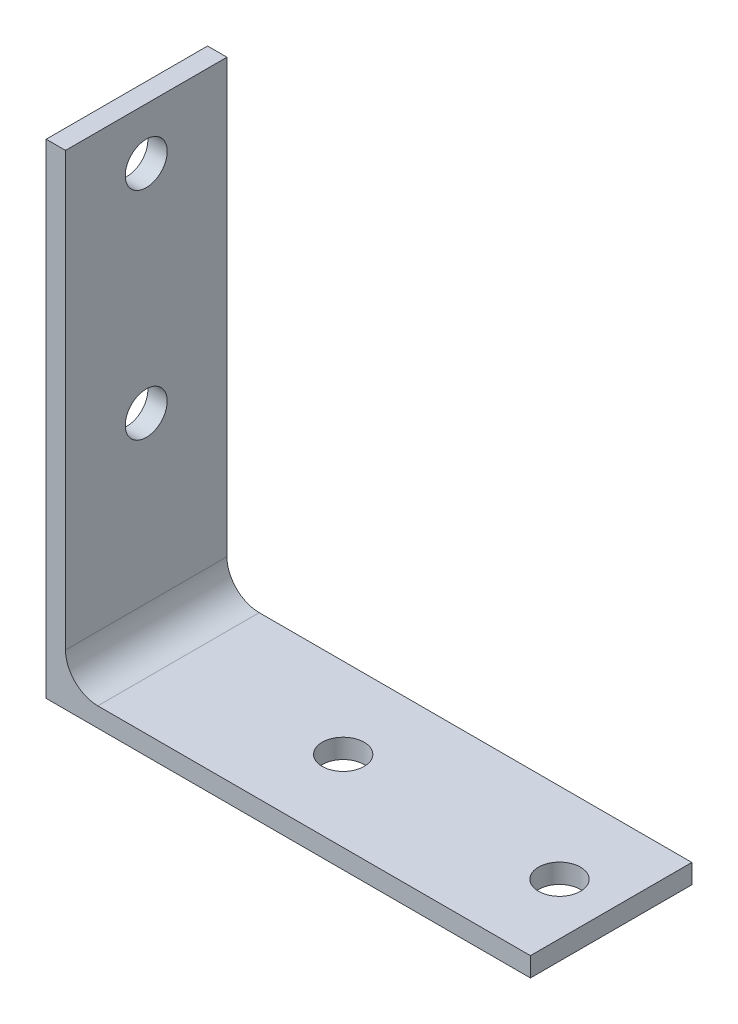
ISO-10303-21;
HEADER;
FILE_DESCRIPTION(('STEP AP214'),'2;1');
FILE_NAME('part.step','',(''),(''),'','','');
FILE_SCHEMA(('AUTOMOTIVE_DESIGN { 1 0 10303 214 1 1 1 1 }'));
ENDSEC;
DATA;
#1=APPLICATION_CONTEXT('core data for automotive mechanical design processes');
#2=APPLICATION_PROTOCOL_DEFINITION('international standard','automotive_design',2000,#1);
#3=PRODUCT_CONTEXT('',#1,'mechanical');
#4=PRODUCT('Part','Part','',(#3));
#5=PRODUCT_RELATED_PRODUCT_CATEGORY('part','',(#4));
#6=PRODUCT_DEFINITION_FORMATION('','',#4);
#7=PRODUCT_DEFINITION_CONTEXT('part definition',#1,'design');
#8=PRODUCT_DEFINITION('design','',#6,#7);
#9=PRODUCT_DEFINITION_SHAPE('','',#8);
#10=(LENGTH_UNIT() NAMED_UNIT(*) SI_UNIT(.MILLI.,.METRE.));
#11=(NAMED_UNIT(*) PLANE_ANGLE_UNIT() SI_UNIT($,.RADIAN.));
#12=(NAMED_UNIT(*) SI_UNIT($,.STERADIAN.) SOLID_ANGLE_UNIT());
#13=UNCERTAINTY_MEASURE_WITH_UNIT(LENGTH_MEASURE(1.E-05),#10,'distance_accuracy_value','');
#14=(GEOMETRIC_REPRESENTATION_CONTEXT(3) GLOBAL_UNCERTAINTY_ASSIGNED_CONTEXT((#13)) GLOBAL_UNIT_ASSIGNED_CONTEXT((#10,
#11,#12)) REPRESENTATION_CONTEXT('',''));
#15=CARTESIAN_POINT('',(0.,0.,0.));
#16=DIRECTION('',(0.,0.,1.));
#17=DIRECTION('',(1.,0.,0.));
#18=AXIS2_PLACEMENT_3D('',#15,#16,#17);
#19=CARTESIAN_POINT('',(0.,0.,6.35));
#20=DIRECTION('',(1.,0.,0.));
#21=DIRECTION('',(0.,0.,-1.));
#22=AXIS2_PLACEMENT_3D('',#19,#20,#21);
#23=PLANE('',#22);
#24=CARTESIAN_POINT('',(0.,34.036,0.));
#25=DIRECTION('',(1.,0.,0.));
#26=DIRECTION('',(0.,1.,0.));
#27=AXIS2_PLACEMENT_3D('',#24,#25,#26);
#28=CIRCLE('',#27,1.651);
#29=CARTESIAN_POINT('',(0.,35.687,0.));
#30=VERTEX_POINT('',#29);
#31=EDGE_CURVE('E150',#30,#30,#28,.T.);
#32=ORIENTED_EDGE('',*,*,#31,.T.);
#33=EDGE_LOOP('',(#32));
#34=FACE_BOUND('',#33,.T.);
#35=CARTESIAN_POINT('',(0.,17.018,0.));
#36=DIRECTION('',(1.,0.,0.));
#37=DIRECTION('',(0.,1.,0.));
#38=AXIS2_PLACEMENT_3D('',#35,#36,#37);
#39=CIRCLE('',#38,1.651);
#40=CARTESIAN_POINT('',(0.,18.669,0.));
#41=VERTEX_POINT('',#40);
#42=EDGE_CURVE('E140',#41,#41,#39,.T.);
#43=ORIENTED_EDGE('',*,*,#42,.T.);
#44=EDGE_LOOP('',(#43));
#45=FACE_BOUND('',#44,.T.);
#46=DIRECTION('',(0.,-1.,0.));
#47=VECTOR('',#46,1.);
#48=CARTESIAN_POINT('',(0.,0.,-6.35));
#49=LINE('',#48,#47);
#50=CARTESIAN_POINT('',(0.,38.1,-6.35));
#51=VERTEX_POINT('',#50);
#52=CARTESIAN_POINT('',(0.,0.,-6.35));
#53=VERTEX_POINT('',#52);
#54=EDGE_CURVE('E113',#51,#53,#49,.T.);
#55=ORIENTED_EDGE('',*,*,#54,.T.);
#56=DIRECTION('',(0.,0.,-1.));
#57=VECTOR('',#56,1.);
#58=CARTESIAN_POINT('',(0.,0.,6.35));
#59=LINE('',#58,#57);
#60=CARTESIAN_POINT('',(0.,0.,6.35));
#61=VERTEX_POINT('',#60);
#62=EDGE_CURVE('E94',#61,#53,#59,.T.);
#63=ORIENTED_EDGE('',*,*,#62,.F.);
#64=DIRECTION('',(0.,-1.,0.));
#65=VECTOR('',#64,1.);
#66=CARTESIAN_POINT('',(0.,0.,6.35));
#67=LINE('',#66,#65);
#68=CARTESIAN_POINT('',(0.,38.1,6.35));
#69=VERTEX_POINT('',#68);
#70=EDGE_CURVE('E101',#69,#61,#67,.T.);
#71=ORIENTED_EDGE('',*,*,#70,.F.);
#72=DIRECTION('',(0.,0.,-1.));
#73=VECTOR('',#72,1.);
#74=CARTESIAN_POINT('',(0.,38.1,6.35));
#75=LINE('',#74,#73);
#76=EDGE_CURVE('E127',#69,#51,#75,.T.);
#77=ORIENTED_EDGE('',*,*,#76,.T.);
#78=EDGE_LOOP('',(#55,#63,#71,#77));
#79=FACE_BOUND('',#78,.T.);
#80=ADVANCED_FACE('F32',(#34,#45,#79),#23,.F.);
#81=CARTESIAN_POINT('',(0.,0.,6.35));
#82=DIRECTION('',(0.,1.,0.));
#83=DIRECTION('',(0.,0.,1.));
#84=AXIS2_PLACEMENT_3D('',#81,#82,#83);
#85=PLANE('',#84);
#86=CARTESIAN_POINT('',(34.036,0.,0.));
#87=DIRECTION('',(0.,1.,0.));
#88=DIRECTION('',(0.,0.,1.));
#89=AXIS2_PLACEMENT_3D('',#86,#87,#88);
#90=CIRCLE('',#89,1.651);
#91=CARTESIAN_POINT('',(34.036,0.,1.651));
#92=VERTEX_POINT('',#91);
#93=EDGE_CURVE('E162',#92,#92,#90,.T.);
#94=ORIENTED_EDGE('',*,*,#93,.T.);
#95=EDGE_LOOP('',(#94));
#96=FACE_BOUND('',#95,.T.);
#97=CARTESIAN_POINT('',(17.018,0.,0.));
#98=DIRECTION('',(0.,1.,0.));
#99=DIRECTION('',(0.,0.,1.));
#100=AXIS2_PLACEMENT_3D('',#97,#98,#99);
#101=CIRCLE('',#100,1.651);
#102=CARTESIAN_POINT('',(17.018,0.,1.651));
#103=VERTEX_POINT('',#102);
#104=EDGE_CURVE('E156',#103,#103,#101,.T.);
#105=ORIENTED_EDGE('',*,*,#104,.T.);
#106=EDGE_LOOP('',(#105));
#107=FACE_BOUND('',#106,.T.);
#108=DIRECTION('',(1.,0.,0.));
#109=VECTOR('',#108,1.);
#110=CARTESIAN_POINT('',(0.,0.,-6.35));
#111=LINE('',#110,#109);
#112=CARTESIAN_POINT('',(38.1,0.,-6.35));
#113=VERTEX_POINT('',#112);
#114=EDGE_CURVE('E137',#53,#113,#111,.T.);
#115=ORIENTED_EDGE('',*,*,#114,.T.);
#116=DIRECTION('',(0.,0.,-1.));
#117=VECTOR('',#116,1.);
#118=CARTESIAN_POINT('',(38.1,0.,6.35));
#119=LINE('',#118,#117);
#120=CARTESIAN_POINT('',(38.1,0.,6.35));
#121=VERTEX_POINT('',#120);
#122=EDGE_CURVE('E97',#121,#113,#119,.T.);
#123=ORIENTED_EDGE('',*,*,#122,.F.);
#124=DIRECTION('',(1.,0.,0.));
#125=VECTOR('',#124,1.);
#126=CARTESIAN_POINT('',(0.,0.,6.35));
#127=LINE('',#126,#125);
#128=EDGE_CURVE('E90',#61,#121,#127,.T.);
#129=ORIENTED_EDGE('',*,*,#128,.F.);
#130=ORIENTED_EDGE('',*,*,#62,.T.);
#131=EDGE_LOOP('',(#115,#123,#129,#130));
#132=FACE_BOUND('',#131,.T.);
#133=ADVANCED_FACE('F92',(#96,#107,#132),#85,.F.);
#134=CARTESIAN_POINT('',(38.1,0.,6.35));
#135=DIRECTION('',(-1.,0.,0.));
#136=DIRECTION('',(0.,0.,1.));
#137=AXIS2_PLACEMENT_3D('',#134,#135,#136);
#138=PLANE('',#137);
#139=DIRECTION('',(0.,1.,0.));
#140=VECTOR('',#139,1.);
#141=CARTESIAN_POINT('',(38.1,0.,-6.35));
#142=LINE('',#141,#140);
#143=CARTESIAN_POINT('',(38.1,1.524,-6.35));
#144=VERTEX_POINT('',#143);
#145=EDGE_CURVE('E134',#113,#144,#142,.T.);
#146=ORIENTED_EDGE('',*,*,#145,.T.);
#147=DIRECTION('',(0.,0.,-1.));
#148=VECTOR('',#147,1.);
#149=CARTESIAN_POINT('',(38.1,1.524,6.35));
#150=LINE('',#149,#148);
#151=CARTESIAN_POINT('',(38.1,1.524,6.35));
#152=VERTEX_POINT('',#151);
#153=EDGE_CURVE('E118',#152,#144,#150,.T.);
#154=ORIENTED_EDGE('',*,*,#153,.F.);
#155=DIRECTION('',(0.,1.,0.));
#156=VECTOR('',#155,1.);
#157=CARTESIAN_POINT('',(38.1,0.,6.35));
#158=LINE('',#157,#156);
#159=EDGE_CURVE('E100',#121,#152,#158,.T.);
#160=ORIENTED_EDGE('',*,*,#159,.F.);
#161=ORIENTED_EDGE('',*,*,#122,.T.);
#162=EDGE_LOOP('',(#146,#154,#160,#161));
#163=FACE_BOUND('',#162,.T.);
#164=ADVANCED_FACE('F184',(#163),#138,.F.);
#165=CARTESIAN_POINT('',(1.524,1.524,6.35));
#166=DIRECTION('',(0.,-1.,0.));
#167=DIRECTION('',(0.,0.,-1.));
#168=AXIS2_PLACEMENT_3D('',#165,#166,#167);
#169=PLANE('',#168);
#170=CARTESIAN_POINT('',(34.036,1.524,0.));
#171=DIRECTION('',(0.,1.,0.));
#172=DIRECTION('',(0.,0.,1.));
#173=AXIS2_PLACEMENT_3D('',#170,#171,#172);
#174=CIRCLE('',#173,1.651);
#175=CARTESIAN_POINT('',(34.036,1.524,1.651));
#176=VERTEX_POINT('',#175);
#177=EDGE_CURVE('E165',#176,#176,#174,.T.);
#178=ORIENTED_EDGE('',*,*,#177,.F.);
#179=EDGE_LOOP('',(#178));
#180=FACE_BOUND('',#179,.T.);
#181=CARTESIAN_POINT('',(17.018,1.524,0.));
#182=DIRECTION('',(0.,1.,0.));
#183=DIRECTION('',(0.,0.,1.));
#184=AXIS2_PLACEMENT_3D('',#181,#182,#183);
#185=CIRCLE('',#184,1.651);
#186=CARTESIAN_POINT('',(17.018,1.524,1.651));
#187=VERTEX_POINT('',#186);
#188=EDGE_CURVE('E159',#187,#187,#185,.T.);
#189=ORIENTED_EDGE('',*,*,#188,.F.);
#190=EDGE_LOOP('',(#189));
#191=FACE_BOUND('',#190,.T.);
#192=DIRECTION('',(-1.,0.,0.));
#193=VECTOR('',#192,1.);
#194=CARTESIAN_POINT('',(1.524,1.524,-6.35));
#195=LINE('',#194,#193);
#196=CARTESIAN_POINT('',(4.064,1.524,-6.35));
#197=VERTEX_POINT('',#196);
#198=EDGE_CURVE('E132',#144,#197,#195,.T.);
#199=ORIENTED_EDGE('',*,*,#198,.T.);
#200=DIRECTION('',(0.,0.,-1.));
#201=VECTOR('',#200,1.);
#202=CARTESIAN_POINT('',(4.064,1.524,6.35));
#203=LINE('',#202,#201);
#204=CARTESIAN_POINT('',(4.06400000000001,1.524,6.35));
#205=VERTEX_POINT('',#204);
#206=EDGE_CURVE('E47',#197,#205,#203,.F.);
#207=ORIENTED_EDGE('',*,*,#206,.T.);
#208=DIRECTION('',(-1.,0.,0.));
#209=VECTOR('',#208,1.);
#210=CARTESIAN_POINT('',(36.576,1.524,6.35));
#211=LINE('',#210,#209);
#212=EDGE_CURVE('E144',#152,#205,#211,.T.);
#213=ORIENTED_EDGE('',*,*,#212,.F.);
#214=ORIENTED_EDGE('',*,*,#153,.T.);
#215=EDGE_LOOP('',(#199,#207,#213,#214));
#216=FACE_BOUND('',#215,.T.);
#217=ADVANCED_FACE('F180',(#180,#191,#216),#169,.F.);
#218=CARTESIAN_POINT('',(1.524,36.576,6.35));
#219=DIRECTION('',(-1.,0.,0.));
#220=DIRECTION('',(0.,-1.,0.));
#221=AXIS2_PLACEMENT_3D('',#218,#219,#220);
#222=PLANE('',#221);
#223=CARTESIAN_POINT('',(1.524,34.036,0.));
#224=DIRECTION('',(1.,0.,0.));
#225=DIRECTION('',(0.,1.,0.));
#226=AXIS2_PLACEMENT_3D('',#223,#224,#225);
#227=CIRCLE('',#226,1.651);
#228=CARTESIAN_POINT('',(1.524,35.687,0.));
#229=VERTEX_POINT('',#228);
#230=EDGE_CURVE('E153',#229,#229,#227,.T.);
#231=ORIENTED_EDGE('',*,*,#230,.F.);
#232=EDGE_LOOP('',(#231));
#233=FACE_BOUND('',#232,.T.);
#234=CARTESIAN_POINT('',(1.524,17.018,0.));
#235=DIRECTION('',(1.,0.,0.));
#236=DIRECTION('',(0.,1.,0.));
#237=AXIS2_PLACEMENT_3D('',#234,#235,#236);
#238=CIRCLE('',#237,1.651);
#239=CARTESIAN_POINT('',(1.524,18.669,0.));
#240=VERTEX_POINT('',#239);
#241=EDGE_CURVE('E147',#240,#240,#238,.T.);
#242=ORIENTED_EDGE('',*,*,#241,.F.);
#243=EDGE_LOOP('',(#242));
#244=FACE_BOUND('',#243,.T.);
#245=DIRECTION('',(0.,1.,0.));
#246=VECTOR('',#245,1.);
#247=CARTESIAN_POINT('',(1.524,1.524,6.35));
#248=LINE('',#247,#246);
#249=CARTESIAN_POINT('',(1.524,4.064,6.35));
#250=VERTEX_POINT('',#249);
#251=CARTESIAN_POINT('',(1.524,38.1,6.35));
#252=VERTEX_POINT('',#251);
#253=EDGE_CURVE('E142',#250,#252,#248,.T.);
#254=ORIENTED_EDGE('',*,*,#253,.F.);
#255=DIRECTION('',(0.,0.,-1.));
#256=VECTOR('',#255,1.);
#257=CARTESIAN_POINT('',(1.524,4.064,-6.35));
#258=LINE('',#257,#256);
#259=CARTESIAN_POINT('',(1.524,4.064,-6.35));
#260=VERTEX_POINT('',#259);
#261=EDGE_CURVE('E114',#250,#260,#258,.T.);
#262=ORIENTED_EDGE('',*,*,#261,.T.);
#263=DIRECTION('',(0.,1.,0.));
#264=VECTOR('',#263,1.);
#265=CARTESIAN_POINT('',(1.524,36.576,-6.35));
#266=LINE('',#265,#264);
#267=CARTESIAN_POINT('',(1.524,38.1,-6.35));
#268=VERTEX_POINT('',#267);
#269=EDGE_CURVE('E130',#260,#268,#266,.T.);
#270=ORIENTED_EDGE('',*,*,#269,.T.);
#271=DIRECTION('',(0.,0.,-1.));
#272=VECTOR('',#271,1.);
#273=CARTESIAN_POINT('',(1.524,38.1,6.35));
#274=LINE('',#273,#272);
#275=EDGE_CURVE('E124',#252,#268,#274,.T.);
#276=ORIENTED_EDGE('',*,*,#275,.F.);
#277=EDGE_LOOP('',(#254,#262,#270,#276));
#278=FACE_BOUND('',#277,.T.);
#279=ADVANCED_FACE('F183',(#233,#244,#278),#222,.F.);
#280=CARTESIAN_POINT('',(0.,38.1,6.35));
#281=DIRECTION('',(0.,-1.,0.));
#282=DIRECTION('',(0.,0.,-1.));
#283=AXIS2_PLACEMENT_3D('',#280,#281,#282);
#284=PLANE('',#283);
#285=DIRECTION('',(-1.,0.,0.));
#286=VECTOR('',#285,1.);
#287=CARTESIAN_POINT('',(0.,38.1,-6.35));
#288=LINE('',#287,#286);
#289=EDGE_CURVE('E110',#268,#51,#288,.T.);
#290=ORIENTED_EDGE('',*,*,#289,.T.);
#291=ORIENTED_EDGE('',*,*,#76,.F.);
#292=DIRECTION('',(-1.,0.,0.));
#293=VECTOR('',#292,1.);
#294=CARTESIAN_POINT('',(0.,38.1,6.35));
#295=LINE('',#294,#293);
#296=EDGE_CURVE('E106',#252,#69,#295,.T.);
#297=ORIENTED_EDGE('',*,*,#296,.F.);
#298=ORIENTED_EDGE('',*,*,#275,.T.);
#299=EDGE_LOOP('',(#290,#291,#297,#298));
#300=FACE_BOUND('',#299,.T.);
#301=ADVANCED_FACE('F197',(#300),#284,.F.);
#302=CARTESIAN_POINT('',(0.,0.,6.35));
#303=DIRECTION('',(0.,0.,-1.));
#304=DIRECTION('',(-1.,0.,0.));
#305=AXIS2_PLACEMENT_3D('',#302,#303,#304);
#306=PLANE('',#305);
#307=ORIENTED_EDGE('',*,*,#70,.T.);
#308=ORIENTED_EDGE('',*,*,#128,.T.);
#309=ORIENTED_EDGE('',*,*,#159,.T.);
#310=ORIENTED_EDGE('',*,*,#212,.T.);
#311=CARTESIAN_POINT('',(4.064,4.064,6.35));
#312=DIRECTION('',(0.,0.,-1.));
#313=DIRECTION('',(-1.,0.,0.));
#314=AXIS2_PLACEMENT_3D('',#311,#312,#313);
#315=CIRCLE('',#314,2.54);
#316=EDGE_CURVE('E11',#205,#250,#315,.T.);
#317=ORIENTED_EDGE('',*,*,#316,.T.);
#318=ORIENTED_EDGE('',*,*,#253,.T.);
#319=ORIENTED_EDGE('',*,*,#296,.T.);
#320=EDGE_LOOP('',(#307,#308,#309,#310,#317,#318,#319));
#321=FACE_BOUND('',#320,.T.);
#322=ADVANCED_FACE('F104',(#321),#306,.F.);
#323=CARTESIAN_POINT('',(0.,0.,-6.35));
#324=DIRECTION('',(0.,0.,-1.));
#325=DIRECTION('',(-1.,0.,0.));
#326=AXIS2_PLACEMENT_3D('',#323,#324,#325);
#327=PLANE('',#326);
#328=ORIENTED_EDGE('',*,*,#54,.F.);
#329=ORIENTED_EDGE('',*,*,#289,.F.);
#330=ORIENTED_EDGE('',*,*,#269,.F.);
#331=CARTESIAN_POINT('',(4.064,4.064,-6.35));
#332=DIRECTION('',(0.,0.,-1.));
#333=DIRECTION('',(-1.,0.,0.));
#334=AXIS2_PLACEMENT_3D('',#331,#332,#333);
#335=CIRCLE('',#334,2.54);
#336=EDGE_CURVE('E40',#260,#197,#335,.F.);
#337=ORIENTED_EDGE('',*,*,#336,.T.);
#338=ORIENTED_EDGE('',*,*,#198,.F.);
#339=ORIENTED_EDGE('',*,*,#145,.F.);
#340=ORIENTED_EDGE('',*,*,#114,.F.);
#341=EDGE_LOOP('',(#328,#329,#330,#337,#338,#339,#340));
#342=FACE_BOUND('',#341,.T.);
#343=ADVANCED_FACE('F198',(#342),#327,.T.);
#344=CARTESIAN_POINT('',(4.064,4.064,6.35));
#345=DIRECTION('',(0.,0.,1.));
#346=DIRECTION('',(1.,0.,0.));
#347=AXIS2_PLACEMENT_3D('',#344,#345,#346);
#348=CYLINDRICAL_SURFACE('',#347,2.54);
#349=ORIENTED_EDGE('',*,*,#316,.F.);
#350=ORIENTED_EDGE('',*,*,#206,.F.);
#351=ORIENTED_EDGE('',*,*,#336,.F.);
#352=ORIENTED_EDGE('',*,*,#261,.F.);
#353=EDGE_LOOP('',(#349,#350,#351,#352));
#354=FACE_BOUND('',#353,.T.);
#355=ADVANCED_FACE('F34',(#354),#348,.F.);
#356=CARTESIAN_POINT('',(0.,17.018,0.));
#357=DIRECTION('',(1.,0.,0.));
#358=DIRECTION('',(0.,1.,0.));
#359=AXIS2_PLACEMENT_3D('',#356,#357,#358);
#360=CYLINDRICAL_SURFACE('',#359,1.651);
#361=ORIENTED_EDGE('',*,*,#42,.F.);
#362=EDGE_LOOP('',(#361));
#363=FACE_BOUND('',#362,.T.);
#364=ORIENTED_EDGE('',*,*,#241,.T.);
#365=EDGE_LOOP('',(#364));
#366=FACE_BOUND('',#365,.T.);
#367=ADVANCED_FACE('F214',(#363,#366),#360,.F.);
#368=CARTESIAN_POINT('',(0.,34.036,0.));
#369=DIRECTION('',(1.,0.,0.));
#370=DIRECTION('',(0.,1.,0.));
#371=AXIS2_PLACEMENT_3D('',#368,#369,#370);
#372=CYLINDRICAL_SURFACE('',#371,1.651);
#373=ORIENTED_EDGE('',*,*,#31,.F.);
#374=EDGE_LOOP('',(#373));
#375=FACE_BOUND('',#374,.T.);
#376=ORIENTED_EDGE('',*,*,#230,.T.);
#377=EDGE_LOOP('',(#376));
#378=FACE_BOUND('',#377,.T.);
#379=ADVANCED_FACE('F217',(#375,#378),#372,.F.);
#380=CARTESIAN_POINT('',(17.018,0.,0.));
#381=DIRECTION('',(0.,1.,0.));
#382=DIRECTION('',(0.,0.,1.));
#383=AXIS2_PLACEMENT_3D('',#380,#381,#382);
#384=CYLINDRICAL_SURFACE('',#383,1.651);
#385=CARTESIAN_POINT('',(17.018,0.,1.651));
#386=CARTESIAN_POINT('',(17.018,0.015875,1.651));
#387=CARTESIAN_POINT('',(17.018,0.03175,1.651));
#388=CARTESIAN_POINT('',(17.018,0.0635,1.651));
#389=CARTESIAN_POINT('',(17.018,0.079375,1.651));
#390=CARTESIAN_POINT('',(17.018,0.111125,1.651));
#391=CARTESIAN_POINT('',(17.018,0.127,1.651));
#392=CARTESIAN_POINT('',(17.018,0.15875,1.651));
#393=CARTESIAN_POINT('',(17.018,0.174625,1.651));
#394=CARTESIAN_POINT('',(17.018,0.206375,1.651));
#395=CARTESIAN_POINT('',(17.018,0.22225,1.651));
#396=CARTESIAN_POINT('',(17.018,0.254,1.651));
#397=CARTESIAN_POINT('',(17.018,0.269875,1.651));
#398=CARTESIAN_POINT('',(17.018,0.301625,1.651));
#399=CARTESIAN_POINT('',(17.018,0.3175,1.651));
#400=CARTESIAN_POINT('',(17.018,0.34925,1.651));
#401=CARTESIAN_POINT('',(17.018,0.365125,1.651));
#402=CARTESIAN_POINT('',(17.018,0.396875,1.651));
#403=CARTESIAN_POINT('',(17.018,0.41275,1.651));
#404=CARTESIAN_POINT('',(17.018,0.4445,1.651));
#405=CARTESIAN_POINT('',(17.018,0.460375,1.651));
#406=CARTESIAN_POINT('',(17.018,0.492125,1.651));
#407=CARTESIAN_POINT('',(17.018,0.508,1.651));
#408=CARTESIAN_POINT('',(17.018,0.53975,1.651));
#409=CARTESIAN_POINT('',(17.018,0.555625,1.651));
#410=CARTESIAN_POINT('',(17.018,0.587375,1.651));
#411=CARTESIAN_POINT('',(17.018,0.60325,1.651));
#412=CARTESIAN_POINT('',(17.018,0.635,1.651));
#413=CARTESIAN_POINT('',(17.018,0.650875,1.651));
#414=CARTESIAN_POINT('',(17.018,0.682625,1.651));
#415=CARTESIAN_POINT('',(17.018,0.6985,1.651));
#416=CARTESIAN_POINT('',(17.018,0.73025,1.651));
#417=CARTESIAN_POINT('',(17.018,0.746125,1.651));
#418=CARTESIAN_POINT('',(17.018,0.777875,1.651));
#419=CARTESIAN_POINT('',(17.018,0.79375,1.651));
#420=CARTESIAN_POINT('',(17.018,0.8255,1.651));
#421=CARTESIAN_POINT('',(17.018,0.841375,1.651));
#422=CARTESIAN_POINT('',(17.018,0.873125,1.651));
#423=CARTESIAN_POINT('',(17.018,0.889,1.651));
#424=CARTESIAN_POINT('',(17.018,0.92075,1.651));
#425=CARTESIAN_POINT('',(17.018,0.936625,1.651));
#426=CARTESIAN_POINT('',(17.018,0.968375,1.651));
#427=CARTESIAN_POINT('',(17.018,0.98425,1.651));
#428=CARTESIAN_POINT('',(17.018,1.016,1.651));
#429=CARTESIAN_POINT('',(17.018,1.031875,1.651));
#430=CARTESIAN_POINT('',(17.018,1.063625,1.651));
#431=CARTESIAN_POINT('',(17.018,1.0795,1.651));
#432=CARTESIAN_POINT('',(17.018,1.11125,1.651));
#433=CARTESIAN_POINT('',(17.018,1.127125,1.651));
#434=CARTESIAN_POINT('',(17.018,1.158875,1.651));
#435=CARTESIAN_POINT('',(17.018,1.17475,1.651));
#436=CARTESIAN_POINT('',(17.018,1.2065,1.651));
#437=CARTESIAN_POINT('',(17.018,1.222375,1.651));
#438=CARTESIAN_POINT('',(17.018,1.254125,1.651));
#439=CARTESIAN_POINT('',(17.018,1.27,1.651));
#440=CARTESIAN_POINT('',(17.018,1.30175,1.651));
#441=CARTESIAN_POINT('',(17.018,1.317625,1.651));
#442=CARTESIAN_POINT('',(17.018,1.349375,1.651));
#443=CARTESIAN_POINT('',(17.018,1.36525,1.651));
#444=CARTESIAN_POINT('',(17.018,1.397,1.651));
#445=CARTESIAN_POINT('',(17.018,1.412875,1.651));
#446=CARTESIAN_POINT('',(17.018,1.444625,1.651));
#447=CARTESIAN_POINT('',(17.018,1.4605,1.651));
#448=CARTESIAN_POINT('',(17.018,1.49225,1.651));
#449=CARTESIAN_POINT('',(17.018,1.508125,1.651));
#450=CARTESIAN_POINT('',(17.018,1.524,1.651));
#451=B_SPLINE_CURVE_WITH_KNOTS('',3,(#385,#386,#387,#388,#389,#390,#391,#392,#393,#394,#395,
#396,#397,#398,#399,#400,#401,#402,#403,#404,#405,#406,#407,#408,#409,#410,#411,#412,#413,#414,
#415,#416,#417,#418,#419,#420,#421,#422,#423,#424,#425,#426,#427,#428,#429,#430,#431,#432,#433,
#434,#435,#436,#437,#438,#439,#440,#441,#442,#443,#444,#445,#446,#447,#448,#449,#450),
.UNSPECIFIED.,.F.,.F.,(4,2,2,2,2,2,2,2,2,2,2,2,2,2,2,2,2,2,2,2,2,2,2,2,2,2,2,2,2,2,2,2,4),(0.,
0.047625,0.09525,0.142875,0.1905,0.238125,0.28575,0.333375,0.381,0.428625,0.47625,0.523875,
0.5715,0.619125,0.66675,0.714375,0.762,0.809625,0.85725,0.904875,0.9525,1.000125,1.04775,
1.095375,1.143,1.190625,1.23825,1.285875,1.3335,1.381125,1.42875,1.476375,1.524),.UNSPECIFIED.);
#452=EDGE_CURVE('BSEAM176',#103,#187,#451,.T.);
#453=ORIENTED_EDGE('',*,*,#104,.F.);
#454=ORIENTED_EDGE('',*,*,#188,.T.);
#455=ORIENTED_EDGE('',*,*,#452,.T.);
#456=ORIENTED_EDGE('',*,*,#452,.F.);
#457=EDGE_LOOP('',(#453,#455,#454,#456));
#458=FACE_BOUND('',#457,.T.);
#459=ADVANCED_FACE('F176',(#458),#384,.F.);
#460=CARTESIAN_POINT('',(34.036,0.,0.));
#461=DIRECTION('',(0.,1.,0.));
#462=DIRECTION('',(0.,0.,1.));
#463=AXIS2_PLACEMENT_3D('',#460,#461,#462);
#464=CYLINDRICAL_SURFACE('',#463,1.651);
#465=CARTESIAN_POINT('',(34.036,0.,1.651));
#466=CARTESIAN_POINT('',(34.036,0.015875,1.651));
#467=CARTESIAN_POINT('',(34.036,0.03175,1.651));
#468=CARTESIAN_POINT('',(34.036,0.0635,1.651));
#469=CARTESIAN_POINT('',(34.036,0.079375,1.651));
#470=CARTESIAN_POINT('',(34.036,0.111125,1.651));
#471=CARTESIAN_POINT('',(34.036,0.127,1.651));
#472=CARTESIAN_POINT('',(34.036,0.15875,1.651));
#473=CARTESIAN_POINT('',(34.036,0.174625,1.651));
#474=CARTESIAN_POINT('',(34.036,0.206375,1.651));
#475=CARTESIAN_POINT('',(34.036,0.22225,1.651));
#476=CARTESIAN_POINT('',(34.036,0.254,1.651));
#477=CARTESIAN_POINT('',(34.036,0.269875,1.651));
#478=CARTESIAN_POINT('',(34.036,0.301625,1.651));
#479=CARTESIAN_POINT('',(34.036,0.3175,1.651));
#480=CARTESIAN_POINT('',(34.036,0.34925,1.651));
#481=CARTESIAN_POINT('',(34.036,0.365125,1.651));
#482=CARTESIAN_POINT('',(34.036,0.396875,1.651));
#483=CARTESIAN_POINT('',(34.036,0.41275,1.651));
#484=CARTESIAN_POINT('',(34.036,0.4445,1.651));
#485=CARTESIAN_POINT('',(34.036,0.460375,1.651));
#486=CARTESIAN_POINT('',(34.036,0.492125,1.651));
#487=CARTESIAN_POINT('',(34.036,0.508,1.651));
#488=CARTESIAN_POINT('',(34.036,0.53975,1.651));
#489=CARTESIAN_POINT('',(34.036,0.555625,1.651));
#490=CARTESIAN_POINT('',(34.036,0.587375,1.651));
#491=CARTESIAN_POINT('',(34.036,0.60325,1.651));
#492=CARTESIAN_POINT('',(34.036,0.635,1.651));
#493=CARTESIAN_POINT('',(34.036,0.650875,1.651));
#494=CARTESIAN_POINT('',(34.036,0.682625,1.651));
#495=CARTESIAN_POINT('',(34.036,0.6985,1.651));
#496=CARTESIAN_POINT('',(34.036,0.73025,1.651));
#497=CARTESIAN_POINT('',(34.036,0.746125,1.651));
#498=CARTESIAN_POINT('',(34.036,0.777875,1.651));
#499=CARTESIAN_POINT('',(34.036,0.79375,1.651));
#500=CARTESIAN_POINT('',(34.036,0.8255,1.651));
#501=CARTESIAN_POINT('',(34.036,0.841375,1.651));
#502=CARTESIAN_POINT('',(34.036,0.873125,1.651));
#503=CARTESIAN_POINT('',(34.036,0.889,1.651));
#504=CARTESIAN_POINT('',(34.036,0.92075,1.651));
#505=CARTESIAN_POINT('',(34.036,0.936625,1.651));
#506=CARTESIAN_POINT('',(34.036,0.968375,1.651));
#507=CARTESIAN_POINT('',(34.036,0.98425,1.651));
#508=CARTESIAN_POINT('',(34.036,1.016,1.651));
#509=CARTESIAN_POINT('',(34.036,1.031875,1.651));
#510=CARTESIAN_POINT('',(34.036,1.063625,1.651));
#511=CARTESIAN_POINT('',(34.036,1.0795,1.651));
#512=CARTESIAN_POINT('',(34.036,1.11125,1.651));
#513=CARTESIAN_POINT('',(34.036,1.127125,1.651));
#514=CARTESIAN_POINT('',(34.036,1.158875,1.651));
#515=CARTESIAN_POINT('',(34.036,1.17475,1.651));
#516=CARTESIAN_POINT('',(34.036,1.2065,1.651));
#517=CARTESIAN_POINT('',(34.036,1.222375,1.651));
#518=CARTESIAN_POINT('',(34.036,1.254125,1.651));
#519=CARTESIAN_POINT('',(34.036,1.27,1.651));
#520=CARTESIAN_POINT('',(34.036,1.30175,1.651));
#521=CARTESIAN_POINT('',(34.036,1.317625,1.651));
#522=CARTESIAN_POINT('',(34.036,1.349375,1.651));
#523=CARTESIAN_POINT('',(34.036,1.36525,1.651));
#524=CARTESIAN_POINT('',(34.036,1.397,1.651));
#525=CARTESIAN_POINT('',(34.036,1.412875,1.651));
#526=CARTESIAN_POINT('',(34.036,1.444625,1.651));
#527=CARTESIAN_POINT('',(34.036,1.4605,1.651));
#528=CARTESIAN_POINT('',(34.036,1.49225,1.651));
#529=CARTESIAN_POINT('',(34.036,1.508125,1.651));
#530=CARTESIAN_POINT('',(34.036,1.524,1.651));
#531=B_SPLINE_CURVE_WITH_KNOTS('',3,(#465,#466,#467,#468,#469,#470,#471,#472,#473,#474,#475,
#476,#477,#478,#479,#480,#481,#482,#483,#484,#485,#486,#487,#488,#489,#490,#491,#492,#493,#494,
#495,#496,#497,#498,#499,#500,#501,#502,#503,#504,#505,#506,#507,#508,#509,#510,#511,#512,#513,
#514,#515,#516,#517,#518,#519,#520,#521,#522,#523,#524,#525,#526,#527,#528,#529,#530),
.UNSPECIFIED.,.F.,.F.,(4,2,2,2,2,2,2,2,2,2,2,2,2,2,2,2,2,2,2,2,2,2,2,2,2,2,2,2,2,2,2,2,4),(0.,
0.047625,0.09525,0.142875,0.1905,0.238125,0.28575,0.333375,0.381,0.428625,0.47625,0.523875,
0.5715,0.619125,0.66675,0.714375,0.762,0.809625,0.85725,0.904875,0.9525,1.000125,1.04775,
1.095375,1.143,1.190625,1.23825,1.285875,1.3335,1.381125,1.42875,1.476375,1.524),.UNSPECIFIED.);
#532=EDGE_CURVE('BSEAM173',#92,#176,#531,.T.);
#533=ORIENTED_EDGE('',*,*,#93,.F.);
#534=ORIENTED_EDGE('',*,*,#177,.T.);
#535=ORIENTED_EDGE('',*,*,#532,.T.);
#536=ORIENTED_EDGE('',*,*,#532,.F.);
#537=EDGE_LOOP('',(#533,#535,#534,#536));
#538=FACE_BOUND('',#537,.T.);
#539=ADVANCED_FACE('F173',(#538),#464,.F.);
#540=CLOSED_SHELL('',(#80,#133,#164,#217,#279,#301,#322,#343,#355,#367,#379,#459,#539));
#541=MANIFOLD_SOLID_BREP('B2',#540);
#542=ADVANCED_BREP_SHAPE_REPRESENTATION('',(#18,#541),#14);
#543=SHAPE_DEFINITION_REPRESENTATION(#9,#542);
ENDSEC;
END-ISO-10303-21;
